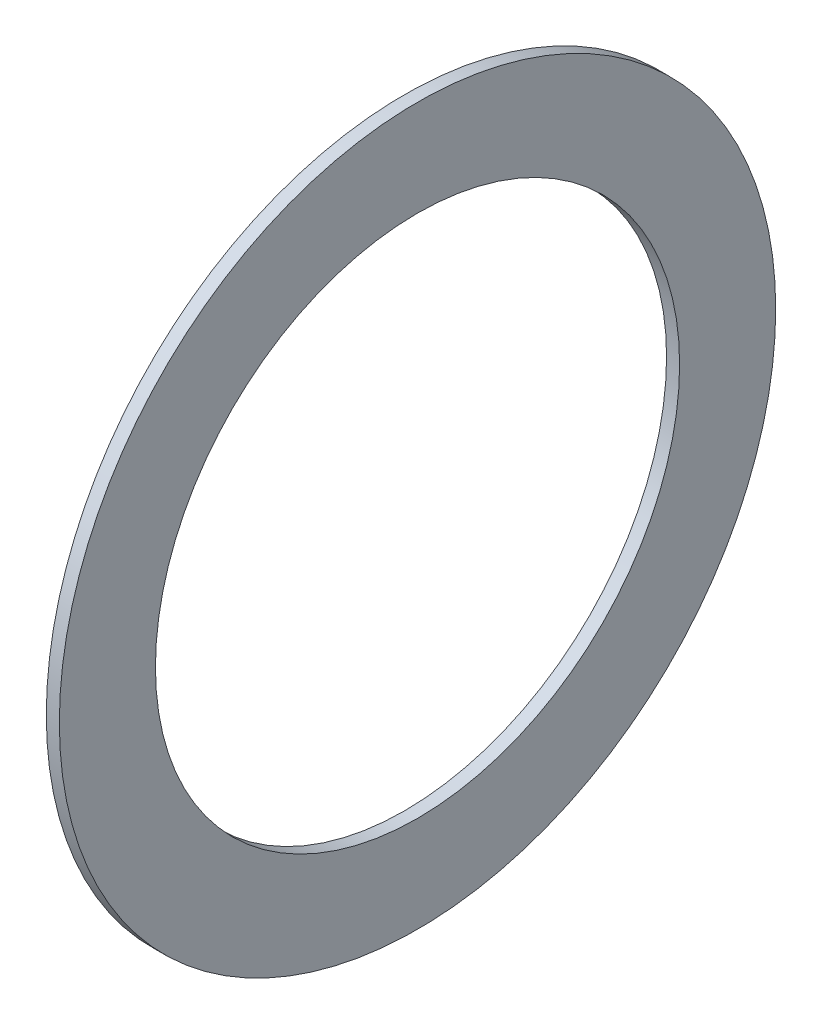
ISO-10303-21;
HEADER;
FILE_DESCRIPTION(('STEP AP214'),'2;1');
FILE_NAME('part.step','',(''),(''),'','','');
FILE_SCHEMA(('AUTOMOTIVE_DESIGN { 1 0 10303 214 1 1 1 1 }'));
ENDSEC;
DATA;
#1=APPLICATION_CONTEXT('core data for automotive mechanical design processes');
#2=APPLICATION_PROTOCOL_DEFINITION('international standard','automotive_design',2000,#1);
#3=PRODUCT_CONTEXT('',#1,'mechanical');
#4=PRODUCT('Part','Part','',(#3));
#5=PRODUCT_RELATED_PRODUCT_CATEGORY('part','',(#4));
#6=PRODUCT_DEFINITION_FORMATION('','',#4);
#7=PRODUCT_DEFINITION_CONTEXT('part definition',#1,'design');
#8=PRODUCT_DEFINITION('design','',#6,#7);
#9=PRODUCT_DEFINITION_SHAPE('','',#8);
#10=(LENGTH_UNIT() NAMED_UNIT(*) SI_UNIT(.MILLI.,.METRE.));
#11=(NAMED_UNIT(*) PLANE_ANGLE_UNIT() SI_UNIT($,.RADIAN.));
#12=(NAMED_UNIT(*) SI_UNIT($,.STERADIAN.) SOLID_ANGLE_UNIT());
#13=UNCERTAINTY_MEASURE_WITH_UNIT(LENGTH_MEASURE(1.E-05),#10,'distance_accuracy_value','');
#14=(GEOMETRIC_REPRESENTATION_CONTEXT(3) GLOBAL_UNCERTAINTY_ASSIGNED_CONTEXT((#13)) GLOBAL_UNIT_ASSIGNED_CONTEXT((#10,
#11,#12)) REPRESENTATION_CONTEXT('',''));
#15=CARTESIAN_POINT('',(0.,0.,0.));
#16=DIRECTION('',(0.,0.,1.));
#17=DIRECTION('',(1.,0.,0.));
#18=AXIS2_PLACEMENT_3D('',#15,#16,#17);
#19=CARTESIAN_POINT('',(2.9502,-4.101,4.101));
#20=DIRECTION('',(1.,0.,0.));
#21=DIRECTION('',(0.,0.,-1.));
#22=AXIS2_PLACEMENT_3D('',#19,#20,#21);
#23=PLANE('',#22);
#24=CARTESIAN_POINT('',(2.9502,0.,0.));
#25=DIRECTION('',(-1.,0.,0.));
#26=DIRECTION('',(0.,0.,1.));
#27=AXIS2_PLACEMENT_3D('',#24,#25,#26);
#28=CIRCLE('',#27,3.);
#29=CARTESIAN_POINT('',(2.9502,0.,3.));
#30=VERTEX_POINT('',#29);
#31=EDGE_CURVE('E28',#30,#30,#28,.F.);
#32=ORIENTED_EDGE('',*,*,#31,.F.);
#33=EDGE_LOOP('',(#32));
#34=FACE_BOUND('',#33,.T.);
#35=CARTESIAN_POINT('',(2.9502,0.,0.));
#36=DIRECTION('',(1.,0.,0.));
#37=DIRECTION('',(0.,0.,-1.));
#38=AXIS2_PLACEMENT_3D('',#35,#36,#37);
#39=CIRCLE('',#38,4.1);
#40=CARTESIAN_POINT('',(2.9502,0.,-4.1));
#41=VERTEX_POINT('',#40);
#42=EDGE_CURVE('E19',#41,#41,#39,.F.);
#43=ORIENTED_EDGE('',*,*,#42,.F.);
#44=EDGE_LOOP('',(#43));
#45=FACE_BOUND('',#44,.T.);
#46=ADVANCED_FACE('F15',(#34,#45),#23,.T.);
#47=CARTESIAN_POINT('',(2.8008,0.,0.));
#48=DIRECTION('',(1.,0.,0.));
#49=DIRECTION('',(0.,0.,-1.));
#50=AXIS2_PLACEMENT_3D('',#47,#48,#49);
#51=CYLINDRICAL_SURFACE('',#50,4.1);
#52=ORIENTED_EDGE('',*,*,#42,.T.);
#53=EDGE_LOOP('',(#52));
#54=FACE_BOUND('',#53,.T.);
#55=CARTESIAN_POINT('',(2.8008,0.,0.));
#56=DIRECTION('',(1.,0.,0.));
#57=DIRECTION('',(0.,0.,-1.));
#58=AXIS2_PLACEMENT_3D('',#55,#56,#57);
#59=CIRCLE('',#58,4.1);
#60=CARTESIAN_POINT('',(2.8008,0.,-4.1));
#61=VERTEX_POINT('',#60);
#62=EDGE_CURVE('E23',#61,#61,#59,.F.);
#63=ORIENTED_EDGE('',*,*,#62,.F.);
#64=EDGE_LOOP('',(#63));
#65=FACE_BOUND('',#64,.T.);
#66=ADVANCED_FACE('F36',(#54,#65),#51,.T.);
#67=CARTESIAN_POINT('',(2.9502,0.,0.));
#68=DIRECTION('',(-1.,0.,0.));
#69=DIRECTION('',(0.,0.,1.));
#70=AXIS2_PLACEMENT_3D('',#67,#68,#69);
#71=CYLINDRICAL_SURFACE('',#70,3.);
#72=CARTESIAN_POINT('',(2.8008,0.,0.));
#73=DIRECTION('',(-1.,0.,0.));
#74=DIRECTION('',(0.,0.,1.));
#75=AXIS2_PLACEMENT_3D('',#72,#73,#74);
#76=CIRCLE('',#75,3.);
#77=CARTESIAN_POINT('',(2.8008,0.,3.));
#78=VERTEX_POINT('',#77);
#79=EDGE_CURVE('E10',#78,#78,#76,.F.);
#80=ORIENTED_EDGE('',*,*,#79,.F.);
#81=EDGE_LOOP('',(#80));
#82=FACE_BOUND('',#81,.T.);
#83=ORIENTED_EDGE('',*,*,#31,.T.);
#84=EDGE_LOOP('',(#83));
#85=FACE_BOUND('',#84,.T.);
#86=ADVANCED_FACE('F46',(#82,#85),#71,.F.);
#87=CARTESIAN_POINT('',(2.8008,-4.101,-4.101));
#88=DIRECTION('',(-1.,0.,0.));
#89=DIRECTION('',(0.,0.,1.));
#90=AXIS2_PLACEMENT_3D('',#87,#88,#89);
#91=PLANE('',#90);
#92=ORIENTED_EDGE('',*,*,#79,.T.);
#93=EDGE_LOOP('',(#92));
#94=FACE_BOUND('',#93,.T.);
#95=ORIENTED_EDGE('',*,*,#62,.T.);
#96=EDGE_LOOP('',(#95));
#97=FACE_BOUND('',#96,.T.);
#98=ADVANCED_FACE('F17',(#94,#97),#91,.T.);
#99=CLOSED_SHELL('',(#46,#66,#86,#98));
#100=MANIFOLD_SOLID_BREP('B1',#99);
#101=ADVANCED_BREP_SHAPE_REPRESENTATION('',(#18,#100),#14);
#102=SHAPE_DEFINITION_REPRESENTATION(#9,#101);
ENDSEC;
END-ISO-10303-21;
